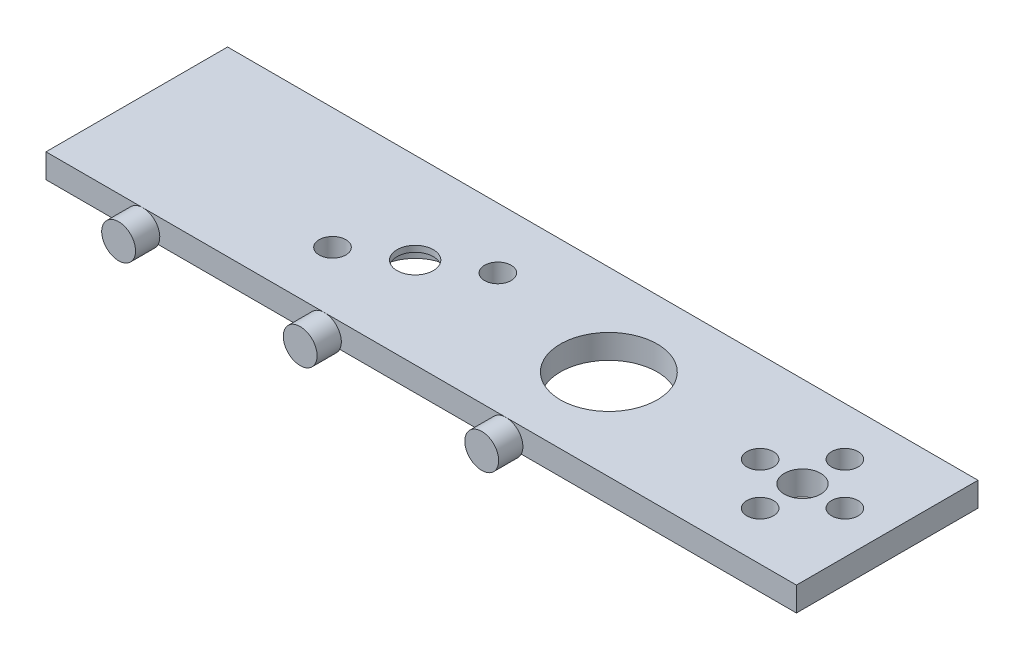
ISO-10303-21;
HEADER;
FILE_DESCRIPTION(('STEP AP214'),'2;1');
FILE_NAME('part.step','',(''),(''),'','','');
FILE_SCHEMA(('AUTOMOTIVE_DESIGN { 1 0 10303 214 1 1 1 1 }'));
ENDSEC;
DATA;
#1=APPLICATION_CONTEXT('core data for automotive mechanical design processes');
#2=APPLICATION_PROTOCOL_DEFINITION('international standard','automotive_design',2000,#1);
#3=PRODUCT_CONTEXT('',#1,'mechanical');
#4=PRODUCT('Part','Part','',(#3));
#5=PRODUCT_RELATED_PRODUCT_CATEGORY('part','',(#4));
#6=PRODUCT_DEFINITION_FORMATION('','',#4);
#7=PRODUCT_DEFINITION_CONTEXT('part definition',#1,'design');
#8=PRODUCT_DEFINITION('design','',#6,#7);
#9=PRODUCT_DEFINITION_SHAPE('','',#8);
#10=(LENGTH_UNIT() NAMED_UNIT(*) SI_UNIT(.MILLI.,.METRE.));
#11=(NAMED_UNIT(*) PLANE_ANGLE_UNIT() SI_UNIT($,.RADIAN.));
#12=(NAMED_UNIT(*) SI_UNIT($,.STERADIAN.) SOLID_ANGLE_UNIT());
#13=UNCERTAINTY_MEASURE_WITH_UNIT(LENGTH_MEASURE(1.E-05),#10,'distance_accuracy_value','');
#14=(GEOMETRIC_REPRESENTATION_CONTEXT(3) GLOBAL_UNCERTAINTY_ASSIGNED_CONTEXT((#13)) GLOBAL_UNIT_ASSIGNED_CONTEXT((#10,
#11,#12)) REPRESENTATION_CONTEXT('',''));
#15=CARTESIAN_POINT('',(0.,0.,0.));
#16=DIRECTION('',(0.,0.,1.));
#17=DIRECTION('',(1.,0.,0.));
#18=AXIS2_PLACEMENT_3D('',#15,#16,#17);
#19=CARTESIAN_POINT('',(-8.,2.,0.));
#20=DIRECTION('',(0.,-1.,0.));
#21=DIRECTION('',(0.,0.,-1.));
#22=AXIS2_PLACEMENT_3D('',#19,#20,#21);
#23=CYLINDRICAL_SURFACE('',#22,1.5);
#24=CARTESIAN_POINT('',(-8.,2.,0.));
#25=DIRECTION('',(0.,1.,0.));
#26=DIRECTION('',(0.,0.,1.));
#27=AXIS2_PLACEMENT_3D('',#24,#25,#26);
#28=CIRCLE('',#27,1.5);
#29=CARTESIAN_POINT('',(-8.,2.,1.5));
#30=VERTEX_POINT('',#29);
#31=EDGE_CURVE('E281',#30,#30,#28,.T.);
#32=ORIENTED_EDGE('',*,*,#31,.T.);
#33=EDGE_LOOP('',(#32));
#34=FACE_BOUND('',#33,.T.);
#35=CARTESIAN_POINT('',(-8.,1.5,0.));
#36=DIRECTION('',(0.,-1.,0.));
#37=DIRECTION('',(0.,0.,-1.));
#38=AXIS2_PLACEMENT_3D('',#35,#36,#37);
#39=CIRCLE('',#38,1.5);
#40=CARTESIAN_POINT('',(-8.,1.5,-1.5));
#41=VERTEX_POINT('',#40);
#42=EDGE_CURVE('E111',#41,#41,#39,.T.);
#43=ORIENTED_EDGE('',*,*,#42,.T.);
#44=EDGE_LOOP('',(#43));
#45=FACE_BOUND('',#44,.T.);
#46=ADVANCED_FACE('F107',(#34,#45),#23,.F.);
#47=CARTESIAN_POINT('',(0.,2.,7.5));
#48=DIRECTION('',(0.,0.,1.));
#49=DIRECTION('',(1.,0.,0.));
#50=AXIS2_PLACEMENT_3D('',#47,#48,#49);
#51=PLANE('',#50);
#52=CARTESIAN_POINT('',(-23.,0.6,7.5));
#53=DIRECTION('',(0.,0.,1.));
#54=DIRECTION('',(1.,0.,0.));
#55=AXIS2_PLACEMENT_3D('',#52,#53,#54);
#56=CIRCLE('',#55,1.4);
#57=CARTESIAN_POINT('',(-23.,2.,7.5));
#58=VERTEX_POINT('',#57);
#59=CARTESIAN_POINT('',(-24.2649110640673,0.,7.5));
#60=VERTEX_POINT('',#59);
#61=EDGE_CURVE('E119',#58,#60,#56,.T.);
#62=ORIENTED_EDGE('',*,*,#61,.F.);
#63=DIRECTION('',(-1.,0.,0.));
#64=VECTOR('',#63,1.);
#65=CARTESIAN_POINT('',(0.,2.,7.5));
#66=LINE('',#65,#64);
#67=CARTESIAN_POINT('',(-31.,2.,7.5));
#68=VERTEX_POINT('',#67);
#69=EDGE_CURVE('E193',#58,#68,#66,.T.);
#70=ORIENTED_EDGE('',*,*,#69,.T.);
#71=DIRECTION('',(0.,-1.,0.));
#72=VECTOR('',#71,1.);
#73=CARTESIAN_POINT('',(-31.,2.,7.5));
#74=LINE('',#73,#72);
#75=CARTESIAN_POINT('',(-31.,0.,7.5));
#76=VERTEX_POINT('',#75);
#77=EDGE_CURVE('E219',#68,#76,#74,.T.);
#78=ORIENTED_EDGE('',*,*,#77,.T.);
#79=DIRECTION('',(-1.,0.,0.));
#80=VECTOR('',#79,1.);
#81=CARTESIAN_POINT('',(0.,0.,7.5));
#82=LINE('',#81,#80);
#83=EDGE_CURVE('E127',#60,#76,#82,.T.);
#84=ORIENTED_EDGE('',*,*,#83,.F.);
#85=EDGE_LOOP('',(#62,#70,#78,#84));
#86=FACE_BOUND('',#85,.T.);
#87=ADVANCED_FACE('F355',(#86),#51,.T.);
#88=CARTESIAN_POINT('',(-21.7350889359327,0.,7.5));
#89=VERTEX_POINT('',#88);
#90=EDGE_CURVE('E12',#89,#58,#56,.T.);
#91=ORIENTED_EDGE('',*,*,#90,.F.);
#92=CARTESIAN_POINT('',(-9.26491106406735,0.,7.5));
#93=VERTEX_POINT('',#92);
#94=EDGE_CURVE('E361',#93,#89,#82,.T.);
#95=ORIENTED_EDGE('',*,*,#94,.F.);
#96=CARTESIAN_POINT('',(-8.,0.6,7.5));
#97=DIRECTION('',(0.,0.,1.));
#98=DIRECTION('',(1.,0.,0.));
#99=AXIS2_PLACEMENT_3D('',#96,#97,#98);
#100=CIRCLE('',#99,1.4);
#101=CARTESIAN_POINT('',(-8.,2.,7.5));
#102=VERTEX_POINT('',#101);
#103=EDGE_CURVE('E224',#102,#93,#100,.T.);
#104=ORIENTED_EDGE('',*,*,#103,.F.);
#105=EDGE_CURVE('E200',#102,#58,#66,.T.);
#106=ORIENTED_EDGE('',*,*,#105,.T.);
#107=EDGE_LOOP('',(#91,#95,#104,#106));
#108=FACE_BOUND('',#107,.T.);
#109=ADVANCED_FACE('F359',(#108),#51,.T.);
#110=CARTESIAN_POINT('',(-6.73508893593265,0.,7.5));
#111=VERTEX_POINT('',#110);
#112=EDGE_CURVE('E117',#111,#102,#100,.T.);
#113=ORIENTED_EDGE('',*,*,#112,.F.);
#114=CARTESIAN_POINT('',(5.73508893593265,0.,7.5));
#115=VERTEX_POINT('',#114);
#116=EDGE_CURVE('E208',#115,#111,#82,.T.);
#117=ORIENTED_EDGE('',*,*,#116,.F.);
#118=CARTESIAN_POINT('',(7.,0.6,7.5));
#119=DIRECTION('',(0.,0.,1.));
#120=DIRECTION('',(1.,0.,0.));
#121=AXIS2_PLACEMENT_3D('',#118,#119,#120);
#122=CIRCLE('',#121,1.4);
#123=CARTESIAN_POINT('',(7.,2.,7.5));
#124=VERTEX_POINT('',#123);
#125=EDGE_CURVE('E205',#124,#115,#122,.T.);
#126=ORIENTED_EDGE('',*,*,#125,.F.);
#127=EDGE_CURVE('E191',#124,#102,#66,.T.);
#128=ORIENTED_EDGE('',*,*,#127,.T.);
#129=EDGE_LOOP('',(#113,#117,#126,#128));
#130=FACE_BOUND('',#129,.T.);
#131=ADVANCED_FACE('F206',(#130),#51,.T.);
#132=CARTESIAN_POINT('',(-12.3301270189222,2.,2.50000000000001));
#133=DIRECTION('',(0.,-1.,0.));
#134=DIRECTION('',(0.,0.,-1.));
#135=AXIS2_PLACEMENT_3D('',#132,#133,#134);
#136=CYLINDRICAL_SURFACE('',#135,1.1);
#137=CARTESIAN_POINT('',(-12.3301270189222,2.,2.50000000000001));
#138=DIRECTION('',(0.,1.,0.));
#139=DIRECTION('',(0.,0.,1.));
#140=AXIS2_PLACEMENT_3D('',#137,#138,#139);
#141=CIRCLE('',#140,1.1);
#142=CARTESIAN_POINT('',(-12.3301270189222,2.,3.60000000000001));
#143=VERTEX_POINT('',#142);
#144=EDGE_CURVE('E238',#143,#143,#141,.T.);
#145=ORIENTED_EDGE('',*,*,#144,.T.);
#146=EDGE_LOOP('',(#145));
#147=FACE_BOUND('',#146,.T.);
#148=CARTESIAN_POINT('',(-12.3301270189222,0.,2.50000000000001));
#149=DIRECTION('',(0.,1.,0.));
#150=DIRECTION('',(0.,0.,1.));
#151=AXIS2_PLACEMENT_3D('',#148,#149,#150);
#152=CIRCLE('',#151,1.1);
#153=CARTESIAN_POINT('',(-12.3301270189222,0.,3.60000000000001));
#154=VERTEX_POINT('',#153);
#155=EDGE_CURVE('E243',#154,#154,#152,.T.);
#156=ORIENTED_EDGE('',*,*,#155,.F.);
#157=EDGE_LOOP('',(#156));
#158=FACE_BOUND('',#157,.T.);
#159=ADVANCED_FACE('F458',(#147,#158),#136,.F.);
#160=CARTESIAN_POINT('',(-3.66987298107781,2.,-2.50000000000001));
#161=DIRECTION('',(0.,-1.,0.));
#162=DIRECTION('',(0.,0.,-1.));
#163=AXIS2_PLACEMENT_3D('',#160,#161,#162);
#164=CYLINDRICAL_SURFACE('',#163,1.1);
#165=CARTESIAN_POINT('',(-3.66987298107781,2.,-2.50000000000001));
#166=DIRECTION('',(0.,1.,0.));
#167=DIRECTION('',(0.,0.,1.));
#168=AXIS2_PLACEMENT_3D('',#165,#166,#167);
#169=CIRCLE('',#168,1.1);
#170=CARTESIAN_POINT('',(-3.66987298107781,2.,-1.40000000000001));
#171=VERTEX_POINT('',#170);
#172=EDGE_CURVE('E248',#171,#171,#169,.T.);
#173=ORIENTED_EDGE('',*,*,#172,.T.);
#174=EDGE_LOOP('',(#173));
#175=FACE_BOUND('',#174,.T.);
#176=CARTESIAN_POINT('',(-3.66987298107781,0.,-2.50000000000001));
#177=DIRECTION('',(0.,1.,0.));
#178=DIRECTION('',(0.,0.,1.));
#179=AXIS2_PLACEMENT_3D('',#176,#177,#178);
#180=CIRCLE('',#179,1.1);
#181=CARTESIAN_POINT('',(-3.66987298107781,0.,-1.40000000000001));
#182=VERTEX_POINT('',#181);
#183=EDGE_CURVE('E242',#182,#182,#180,.T.);
#184=ORIENTED_EDGE('',*,*,#183,.F.);
#185=EDGE_LOOP('',(#184));
#186=FACE_BOUND('',#185,.T.);
#187=ADVANCED_FACE('F448',(#175,#186),#164,.F.);
#188=CARTESIAN_POINT('',(8.26491106406735,0.,7.5));
#189=VERTEX_POINT('',#188);
#190=EDGE_CURVE('E183',#189,#124,#122,.T.);
#191=ORIENTED_EDGE('',*,*,#190,.F.);
#192=CARTESIAN_POINT('',(31.,0.,7.5));
#193=VERTEX_POINT('',#192);
#194=EDGE_CURVE('E323',#193,#189,#82,.T.);
#195=ORIENTED_EDGE('',*,*,#194,.F.);
#196=DIRECTION('',(0.,-1.,0.));
#197=VECTOR('',#196,1.);
#198=CARTESIAN_POINT('',(31.,2.,7.5));
#199=LINE('',#198,#197);
#200=CARTESIAN_POINT('',(31.,2.,7.5));
#201=VERTEX_POINT('',#200);
#202=EDGE_CURVE('E185',#201,#193,#199,.T.);
#203=ORIENTED_EDGE('',*,*,#202,.F.);
#204=EDGE_CURVE('E178',#201,#124,#66,.T.);
#205=ORIENTED_EDGE('',*,*,#204,.T.);
#206=EDGE_LOOP('',(#191,#195,#203,#205));
#207=FACE_BOUND('',#206,.T.);
#208=ADVANCED_FACE('F180',(#207),#51,.T.);
#209=CARTESIAN_POINT('',(31.,2.,0.));
#210=DIRECTION('',(1.,0.,0.));
#211=DIRECTION('',(0.,0.,-1.));
#212=AXIS2_PLACEMENT_3D('',#209,#210,#211);
#213=PLANE('',#212);
#214=DIRECTION('',(0.,0.,1.));
#215=VECTOR('',#214,1.);
#216=CARTESIAN_POINT('',(31.,0.,0.));
#217=LINE('',#216,#215);
#218=CARTESIAN_POINT('',(31.,0.,-7.5));
#219=VERTEX_POINT('',#218);
#220=EDGE_CURVE('E326',#219,#193,#217,.T.);
#221=ORIENTED_EDGE('',*,*,#220,.F.);
#222=DIRECTION('',(0.,-1.,0.));
#223=VECTOR('',#222,1.);
#224=CARTESIAN_POINT('',(31.,2.,-7.5));
#225=LINE('',#224,#223);
#226=CARTESIAN_POINT('',(31.,2.,-7.5));
#227=VERTEX_POINT('',#226);
#228=EDGE_CURVE('E336',#227,#219,#225,.T.);
#229=ORIENTED_EDGE('',*,*,#228,.F.);
#230=DIRECTION('',(0.,0.,1.));
#231=VECTOR('',#230,1.);
#232=CARTESIAN_POINT('',(31.,2.,0.));
#233=LINE('',#232,#231);
#234=EDGE_CURVE('E190',#227,#201,#233,.T.);
#235=ORIENTED_EDGE('',*,*,#234,.T.);
#236=ORIENTED_EDGE('',*,*,#202,.T.);
#237=EDGE_LOOP('',(#221,#229,#235,#236));
#238=FACE_BOUND('',#237,.T.);
#239=ADVANCED_FACE('F342',(#238),#213,.T.);
#240=CARTESIAN_POINT('',(0.,2.,-7.5));
#241=DIRECTION('',(0.,0.,-1.));
#242=DIRECTION('',(-1.,0.,0.));
#243=AXIS2_PLACEMENT_3D('',#240,#241,#242);
#244=PLANE('',#243);
#245=DIRECTION('',(1.,0.,0.));
#246=VECTOR('',#245,1.);
#247=CARTESIAN_POINT('',(0.,0.,-7.5));
#248=LINE('',#247,#246);
#249=CARTESIAN_POINT('',(-31.,0.,-7.5));
#250=VERTEX_POINT('',#249);
#251=EDGE_CURVE('E261',#250,#219,#248,.T.);
#252=ORIENTED_EDGE('',*,*,#251,.F.);
#253=DIRECTION('',(0.,-1.,0.));
#254=VECTOR('',#253,1.);
#255=CARTESIAN_POINT('',(-31.,2.,-7.5));
#256=LINE('',#255,#254);
#257=CARTESIAN_POINT('',(-31.,2.,-7.5));
#258=VERTEX_POINT('',#257);
#259=EDGE_CURVE('E295',#258,#250,#256,.T.);
#260=ORIENTED_EDGE('',*,*,#259,.F.);
#261=DIRECTION('',(1.,0.,0.));
#262=VECTOR('',#261,1.);
#263=CARTESIAN_POINT('',(0.,2.,-7.5));
#264=LINE('',#263,#262);
#265=EDGE_CURVE('E291',#258,#227,#264,.T.);
#266=ORIENTED_EDGE('',*,*,#265,.T.);
#267=ORIENTED_EDGE('',*,*,#228,.T.);
#268=EDGE_LOOP('',(#252,#260,#266,#267));
#269=FACE_BOUND('',#268,.T.);
#270=ADVANCED_FACE('F350',(#269),#244,.T.);
#271=CARTESIAN_POINT('',(-31.,2.,0.));
#272=DIRECTION('',(-1.,0.,0.));
#273=DIRECTION('',(0.,0.,1.));
#274=AXIS2_PLACEMENT_3D('',#271,#272,#273);
#275=PLANE('',#274);
#276=DIRECTION('',(0.,0.,-1.));
#277=VECTOR('',#276,1.);
#278=CARTESIAN_POINT('',(-31.,0.,0.));
#279=LINE('',#278,#277);
#280=EDGE_CURVE('E319',#76,#250,#279,.T.);
#281=ORIENTED_EDGE('',*,*,#280,.F.);
#282=ORIENTED_EDGE('',*,*,#77,.F.);
#283=DIRECTION('',(0.,0.,-1.));
#284=VECTOR('',#283,1.);
#285=CARTESIAN_POINT('',(-31.,2.,0.));
#286=LINE('',#285,#284);
#287=EDGE_CURVE('E285',#68,#258,#286,.T.);
#288=ORIENTED_EDGE('',*,*,#287,.T.);
#289=ORIENTED_EDGE('',*,*,#259,.T.);
#290=EDGE_LOOP('',(#281,#282,#288,#289));
#291=FACE_BOUND('',#290,.T.);
#292=ADVANCED_FACE('F354',(#291),#275,.T.);
#293=CARTESIAN_POINT('',(8.,2.,0.));
#294=DIRECTION('',(0.,-1.,0.));
#295=DIRECTION('',(0.,0.,-1.));
#296=AXIS2_PLACEMENT_3D('',#293,#294,#295);
#297=CYLINDRICAL_SURFACE('',#296,4.);
#298=CARTESIAN_POINT('',(8.,2.,0.));
#299=DIRECTION('',(0.,1.,0.));
#300=DIRECTION('',(0.,0.,1.));
#301=AXIS2_PLACEMENT_3D('',#298,#299,#300);
#302=CIRCLE('',#301,4.);
#303=CARTESIAN_POINT('',(8.,2.,4.));
#304=VERTEX_POINT('',#303);
#305=EDGE_CURVE('E277',#304,#304,#302,.T.);
#306=ORIENTED_EDGE('',*,*,#305,.T.);
#307=EDGE_LOOP('',(#306));
#308=FACE_BOUND('',#307,.T.);
#309=CARTESIAN_POINT('',(8.,0.,0.));
#310=DIRECTION('',(0.,1.,0.));
#311=DIRECTION('',(0.,0.,1.));
#312=AXIS2_PLACEMENT_3D('',#309,#310,#311);
#313=CIRCLE('',#312,4.);
#314=CARTESIAN_POINT('',(8.,0.,4.));
#315=VERTEX_POINT('',#314);
#316=EDGE_CURVE('E315',#315,#315,#313,.T.);
#317=ORIENTED_EDGE('',*,*,#316,.F.);
#318=EDGE_LOOP('',(#317));
#319=FACE_BOUND('',#318,.T.);
#320=ADVANCED_FACE('F424',(#308,#319),#297,.F.);
#321=CARTESIAN_POINT('',(24.,2.,0.));
#322=DIRECTION('',(0.,-1.,0.));
#323=DIRECTION('',(0.,0.,-1.));
#324=AXIS2_PLACEMENT_3D('',#321,#322,#323);
#325=CYLINDRICAL_SURFACE('',#324,1.5);
#326=CARTESIAN_POINT('',(24.,2.,0.));
#327=DIRECTION('',(0.,1.,0.));
#328=DIRECTION('',(0.,0.,1.));
#329=AXIS2_PLACEMENT_3D('',#326,#327,#328);
#330=CIRCLE('',#329,1.5);
#331=CARTESIAN_POINT('',(24.,2.,1.5));
#332=VERTEX_POINT('',#331);
#333=EDGE_CURVE('E273',#332,#332,#330,.T.);
#334=ORIENTED_EDGE('',*,*,#333,.T.);
#335=EDGE_LOOP('',(#334));
#336=FACE_BOUND('',#335,.T.);
#337=CARTESIAN_POINT('',(24.,0.,0.));
#338=DIRECTION('',(0.,1.,0.));
#339=DIRECTION('',(0.,0.,1.));
#340=AXIS2_PLACEMENT_3D('',#337,#338,#339);
#341=CIRCLE('',#340,1.5);
#342=CARTESIAN_POINT('',(24.,0.,1.5));
#343=VERTEX_POINT('',#342);
#344=EDGE_CURVE('E311',#343,#343,#341,.T.);
#345=ORIENTED_EDGE('',*,*,#344,.F.);
#346=EDGE_LOOP('',(#345));
#347=FACE_BOUND('',#346,.T.);
#348=ADVANCED_FACE('F426',(#336,#347),#325,.F.);
#349=CARTESIAN_POINT('',(27.5,2.,0.));
#350=DIRECTION('',(0.,-1.,0.));
#351=DIRECTION('',(0.,0.,-1.));
#352=AXIS2_PLACEMENT_3D('',#349,#350,#351);
#353=CYLINDRICAL_SURFACE('',#352,1.1);
#354=CARTESIAN_POINT('',(27.5,2.,0.));
#355=DIRECTION('',(0.,1.,0.));
#356=DIRECTION('',(0.,0.,1.));
#357=AXIS2_PLACEMENT_3D('',#354,#355,#356);
#358=CIRCLE('',#357,1.1);
#359=CARTESIAN_POINT('',(27.5,2.,1.1));
#360=VERTEX_POINT('',#359);
#361=EDGE_CURVE('E269',#360,#360,#358,.T.);
#362=ORIENTED_EDGE('',*,*,#361,.T.);
#363=EDGE_LOOP('',(#362));
#364=FACE_BOUND('',#363,.T.);
#365=CARTESIAN_POINT('',(27.5,0.,0.));
#366=DIRECTION('',(0.,1.,0.));
#367=DIRECTION('',(0.,0.,1.));
#368=AXIS2_PLACEMENT_3D('',#365,#366,#367);
#369=CIRCLE('',#368,1.1);
#370=CARTESIAN_POINT('',(27.5,0.,1.1));
#371=VERTEX_POINT('',#370);
#372=EDGE_CURVE('E307',#371,#371,#369,.T.);
#373=ORIENTED_EDGE('',*,*,#372,.F.);
#374=EDGE_LOOP('',(#373));
#375=FACE_BOUND('',#374,.T.);
#376=ADVANCED_FACE('F433',(#364,#375),#353,.F.);
#377=CARTESIAN_POINT('',(24.,2.,3.5));
#378=DIRECTION('',(0.,-1.,0.));
#379=DIRECTION('',(0.,0.,-1.));
#380=AXIS2_PLACEMENT_3D('',#377,#378,#379);
#381=CYLINDRICAL_SURFACE('',#380,1.1);
#382=CARTESIAN_POINT('',(24.,2.,3.5));
#383=DIRECTION('',(0.,1.,0.));
#384=DIRECTION('',(0.,0.,1.));
#385=AXIS2_PLACEMENT_3D('',#382,#383,#384);
#386=CIRCLE('',#385,1.1);
#387=CARTESIAN_POINT('',(24.,2.,4.6));
#388=VERTEX_POINT('',#387);
#389=EDGE_CURVE('E265',#388,#388,#386,.T.);
#390=ORIENTED_EDGE('',*,*,#389,.T.);
#391=EDGE_LOOP('',(#390));
#392=FACE_BOUND('',#391,.T.);
#393=CARTESIAN_POINT('',(24.,0.,3.5));
#394=DIRECTION('',(0.,1.,0.));
#395=DIRECTION('',(0.,0.,1.));
#396=AXIS2_PLACEMENT_3D('',#393,#394,#395);
#397=CIRCLE('',#396,1.1);
#398=CARTESIAN_POINT('',(24.,0.,4.6));
#399=VERTEX_POINT('',#398);
#400=EDGE_CURVE('E303',#399,#399,#397,.T.);
#401=ORIENTED_EDGE('',*,*,#400,.F.);
#402=EDGE_LOOP('',(#401));
#403=FACE_BOUND('',#402,.T.);
#404=ADVANCED_FACE('F607',(#392,#403),#381,.F.);
#405=CARTESIAN_POINT('',(20.5,2.,0.));
#406=DIRECTION('',(0.,-1.,0.));
#407=DIRECTION('',(0.,0.,-1.));
#408=AXIS2_PLACEMENT_3D('',#405,#406,#407);
#409=CYLINDRICAL_SURFACE('',#408,1.1);
#410=CARTESIAN_POINT('',(20.5,2.,0.));
#411=DIRECTION('',(0.,1.,0.));
#412=DIRECTION('',(0.,0.,1.));
#413=AXIS2_PLACEMENT_3D('',#410,#411,#412);
#414=CIRCLE('',#413,1.1);
#415=CARTESIAN_POINT('',(20.5,2.,1.1));
#416=VERTEX_POINT('',#415);
#417=EDGE_CURVE('E260',#416,#416,#414,.T.);
#418=ORIENTED_EDGE('',*,*,#417,.T.);
#419=EDGE_LOOP('',(#418));
#420=FACE_BOUND('',#419,.T.);
#421=CARTESIAN_POINT('',(20.5,0.,0.));
#422=DIRECTION('',(0.,1.,0.));
#423=DIRECTION('',(0.,0.,1.));
#424=AXIS2_PLACEMENT_3D('',#421,#422,#423);
#425=CIRCLE('',#424,1.1);
#426=CARTESIAN_POINT('',(20.5,0.,1.1));
#427=VERTEX_POINT('',#426);
#428=EDGE_CURVE('E299',#427,#427,#425,.T.);
#429=ORIENTED_EDGE('',*,*,#428,.F.);
#430=EDGE_LOOP('',(#429));
#431=FACE_BOUND('',#430,.T.);
#432=ADVANCED_FACE('F603',(#420,#431),#409,.F.);
#433=CARTESIAN_POINT('',(24.,2.,-3.5));
#434=DIRECTION('',(0.,-1.,0.));
#435=DIRECTION('',(0.,0.,-1.));
#436=AXIS2_PLACEMENT_3D('',#433,#434,#435);
#437=CYLINDRICAL_SURFACE('',#436,1.1);
#438=CARTESIAN_POINT('',(24.,2.,-3.5));
#439=DIRECTION('',(0.,1.,0.));
#440=DIRECTION('',(0.,0.,1.));
#441=AXIS2_PLACEMENT_3D('',#438,#439,#440);
#442=CIRCLE('',#441,1.1);
#443=CARTESIAN_POINT('',(24.,2.,-2.4));
#444=VERTEX_POINT('',#443);
#445=EDGE_CURVE('E256',#444,#444,#442,.T.);
#446=ORIENTED_EDGE('',*,*,#445,.T.);
#447=EDGE_LOOP('',(#446));
#448=FACE_BOUND('',#447,.T.);
#449=CARTESIAN_POINT('',(24.,0.,-3.5));
#450=DIRECTION('',(0.,1.,0.));
#451=DIRECTION('',(0.,0.,1.));
#452=AXIS2_PLACEMENT_3D('',#449,#450,#451);
#453=CIRCLE('',#452,1.1);
#454=CARTESIAN_POINT('',(24.,0.,-2.4));
#455=VERTEX_POINT('',#454);
#456=EDGE_CURVE('E252',#455,#455,#453,.T.);
#457=ORIENTED_EDGE('',*,*,#456,.F.);
#458=EDGE_LOOP('',(#457));
#459=FACE_BOUND('',#458,.T.);
#460=ADVANCED_FACE('F109',(#448,#459),#437,.F.);
#461=CARTESIAN_POINT('',(0.,0.,0.));
#462=DIRECTION('',(0.,1.,0.));
#463=DIRECTION('',(0.,0.,1.));
#464=AXIS2_PLACEMENT_3D('',#461,#462,#463);
#465=PLANE('',#464);
#466=CARTESIAN_POINT('',(-8.,0.,0.));
#467=DIRECTION('',(0.,-1.,0.));
#468=DIRECTION('',(0.,0.,-1.));
#469=AXIS2_PLACEMENT_3D('',#466,#467,#468);
#470=CIRCLE('',#469,3.);
#471=CARTESIAN_POINT('',(-8.,0.,-3.));
#472=VERTEX_POINT('',#471);
#473=EDGE_CURVE('E392',#472,#472,#470,.T.);
#474=ORIENTED_EDGE('',*,*,#473,.F.);
#475=EDGE_LOOP('',(#474));
#476=FACE_BOUND('',#475,.T.);
#477=ORIENTED_EDGE('',*,*,#456,.T.);
#478=EDGE_LOOP('',(#477));
#479=FACE_BOUND('',#478,.T.);
#480=ORIENTED_EDGE('',*,*,#428,.T.);
#481=EDGE_LOOP('',(#480));
#482=FACE_BOUND('',#481,.T.);
#483=ORIENTED_EDGE('',*,*,#400,.T.);
#484=EDGE_LOOP('',(#483));
#485=FACE_BOUND('',#484,.T.);
#486=ORIENTED_EDGE('',*,*,#372,.T.);
#487=EDGE_LOOP('',(#486));
#488=FACE_BOUND('',#487,.T.);
#489=ORIENTED_EDGE('',*,*,#344,.T.);
#490=EDGE_LOOP('',(#489));
#491=FACE_BOUND('',#490,.T.);
#492=ORIENTED_EDGE('',*,*,#316,.T.);
#493=EDGE_LOOP('',(#492));
#494=FACE_BOUND('',#493,.T.);
#495=ORIENTED_EDGE('',*,*,#280,.T.);
#496=ORIENTED_EDGE('',*,*,#251,.T.);
#497=ORIENTED_EDGE('',*,*,#220,.T.);
#498=ORIENTED_EDGE('',*,*,#194,.T.);
#499=EDGE_CURVE('E327',#189,#115,#82,.T.);
#500=ORIENTED_EDGE('',*,*,#499,.T.);
#501=ORIENTED_EDGE('',*,*,#116,.T.);
#502=EDGE_CURVE('E369',#111,#93,#82,.T.);
#503=ORIENTED_EDGE('',*,*,#502,.T.);
#504=ORIENTED_EDGE('',*,*,#94,.T.);
#505=EDGE_CURVE('E375',#89,#60,#82,.T.);
#506=ORIENTED_EDGE('',*,*,#505,.T.);
#507=ORIENTED_EDGE('',*,*,#83,.T.);
#508=EDGE_LOOP('',(#495,#496,#497,#498,#500,#501,#503,#504,#506,#507));
#509=FACE_BOUND('',#508,.T.);
#510=ORIENTED_EDGE('',*,*,#183,.T.);
#511=EDGE_LOOP('',(#510));
#512=FACE_BOUND('',#511,.T.);
#513=ORIENTED_EDGE('',*,*,#155,.T.);
#514=EDGE_LOOP('',(#513));
#515=FACE_BOUND('',#514,.T.);
#516=ADVANCED_FACE('F345',(#476,#479,#482,#485,#488,#491,#494,#509,#512,#515),#465,.F.);
#517=CARTESIAN_POINT('',(0.,2.,0.));
#518=DIRECTION('',(0.,1.,0.));
#519=DIRECTION('',(0.,0.,1.));
#520=AXIS2_PLACEMENT_3D('',#517,#518,#519);
#521=PLANE('',#520);
#522=ORIENTED_EDGE('',*,*,#172,.F.);
#523=EDGE_LOOP('',(#522));
#524=FACE_BOUND('',#523,.T.);
#525=ORIENTED_EDGE('',*,*,#445,.F.);
#526=EDGE_LOOP('',(#525));
#527=FACE_BOUND('',#526,.T.);
#528=ORIENTED_EDGE('',*,*,#417,.F.);
#529=EDGE_LOOP('',(#528));
#530=FACE_BOUND('',#529,.T.);
#531=ORIENTED_EDGE('',*,*,#389,.F.);
#532=EDGE_LOOP('',(#531));
#533=FACE_BOUND('',#532,.T.);
#534=ORIENTED_EDGE('',*,*,#361,.F.);
#535=EDGE_LOOP('',(#534));
#536=FACE_BOUND('',#535,.T.);
#537=ORIENTED_EDGE('',*,*,#333,.F.);
#538=EDGE_LOOP('',(#537));
#539=FACE_BOUND('',#538,.T.);
#540=ORIENTED_EDGE('',*,*,#305,.F.);
#541=EDGE_LOOP('',(#540));
#542=FACE_BOUND('',#541,.T.);
#543=ORIENTED_EDGE('',*,*,#31,.F.);
#544=EDGE_LOOP('',(#543));
#545=FACE_BOUND('',#544,.T.);
#546=ORIENTED_EDGE('',*,*,#287,.F.);
#547=ORIENTED_EDGE('',*,*,#69,.F.);
#548=ORIENTED_EDGE('',*,*,#105,.F.);
#549=ORIENTED_EDGE('',*,*,#127,.F.);
#550=ORIENTED_EDGE('',*,*,#204,.F.);
#551=ORIENTED_EDGE('',*,*,#234,.F.);
#552=ORIENTED_EDGE('',*,*,#265,.F.);
#553=EDGE_LOOP('',(#546,#547,#548,#549,#550,#551,#552));
#554=FACE_BOUND('',#553,.T.);
#555=ORIENTED_EDGE('',*,*,#144,.F.);
#556=EDGE_LOOP('',(#555));
#557=FACE_BOUND('',#556,.T.);
#558=ADVANCED_FACE('F197',(#524,#527,#530,#533,#536,#539,#542,#545,#554,#557),#521,.T.);
#559=CARTESIAN_POINT('',(7.,0.6,9.5));
#560=DIRECTION('',(0.,0.,-1.));
#561=DIRECTION('',(-1.,0.,0.));
#562=AXIS2_PLACEMENT_3D('',#559,#560,#561);
#563=CYLINDRICAL_SURFACE('',#562,1.4);
#564=CARTESIAN_POINT('',(7.,0.6,9.5));
#565=DIRECTION('',(0.,0.,1.));
#566=DIRECTION('',(1.,0.,0.));
#567=AXIS2_PLACEMENT_3D('',#564,#565,#566);
#568=CIRCLE('',#567,1.4);
#569=CARTESIAN_POINT('',(8.4,0.6,9.5));
#570=VERTEX_POINT('',#569);
#571=EDGE_CURVE('E229',#570,#570,#568,.T.);
#572=ORIENTED_EDGE('',*,*,#571,.F.);
#573=EDGE_LOOP('',(#572));
#574=FACE_BOUND('',#573,.T.);
#575=ORIENTED_EDGE('',*,*,#125,.T.);
#576=EDGE_CURVE('E214',#115,#189,#122,.T.);
#577=ORIENTED_EDGE('',*,*,#576,.T.);
#578=ORIENTED_EDGE('',*,*,#190,.T.);
#579=EDGE_LOOP('',(#575,#577,#578));
#580=FACE_BOUND('',#579,.T.);
#581=ADVANCED_FACE('F216',(#574,#580),#563,.T.);
#582=CARTESIAN_POINT('',(7.,0.6,9.5));
#583=DIRECTION('',(0.,0.,1.));
#584=DIRECTION('',(1.,0.,0.));
#585=AXIS2_PLACEMENT_3D('',#582,#583,#584);
#586=PLANE('',#585);
#587=ORIENTED_EDGE('',*,*,#571,.T.);
#588=EDGE_LOOP('',(#587));
#589=FACE_BOUND('',#588,.T.);
#590=ADVANCED_FACE('F463',(#589),#586,.T.);
#591=CARTESIAN_POINT('',(7.,0.6,7.5));
#592=DIRECTION('',(0.,0.,1.));
#593=DIRECTION('',(1.,0.,0.));
#594=AXIS2_PLACEMENT_3D('',#591,#592,#593);
#595=PLANE('',#594);
#596=ORIENTED_EDGE('',*,*,#499,.F.);
#597=ORIENTED_EDGE('',*,*,#576,.F.);
#598=EDGE_LOOP('',(#596,#597));
#599=FACE_BOUND('',#598,.T.);
#600=ADVANCED_FACE('F466',(#599),#595,.F.);
#601=CARTESIAN_POINT('',(-8.,0.6,9.5));
#602=DIRECTION('',(0.,0.,-1.));
#603=DIRECTION('',(-1.,0.,0.));
#604=AXIS2_PLACEMENT_3D('',#601,#602,#603);
#605=CYLINDRICAL_SURFACE('',#604,1.4);
#606=CARTESIAN_POINT('',(-8.,0.6,9.5));
#607=DIRECTION('',(0.,0.,1.));
#608=DIRECTION('',(1.,0.,0.));
#609=AXIS2_PLACEMENT_3D('',#606,#607,#608);
#610=CIRCLE('',#609,1.4);
#611=CARTESIAN_POINT('',(-6.6,0.6,9.5));
#612=VERTEX_POINT('',#611);
#613=EDGE_CURVE('E213',#612,#612,#610,.T.);
#614=ORIENTED_EDGE('',*,*,#613,.F.);
#615=EDGE_LOOP('',(#614));
#616=FACE_BOUND('',#615,.T.);
#617=ORIENTED_EDGE('',*,*,#103,.T.);
#618=EDGE_CURVE('E225',#93,#111,#100,.T.);
#619=ORIENTED_EDGE('',*,*,#618,.T.);
#620=ORIENTED_EDGE('',*,*,#112,.T.);
#621=EDGE_LOOP('',(#617,#619,#620));
#622=FACE_BOUND('',#621,.T.);
#623=ADVANCED_FACE('F366',(#616,#622),#605,.T.);
#624=CARTESIAN_POINT('',(-8.,0.6,9.5));
#625=DIRECTION('',(0.,0.,1.));
#626=DIRECTION('',(1.,0.,0.));
#627=AXIS2_PLACEMENT_3D('',#624,#625,#626);
#628=PLANE('',#627);
#629=ORIENTED_EDGE('',*,*,#613,.T.);
#630=EDGE_LOOP('',(#629));
#631=FACE_BOUND('',#630,.T.);
#632=ADVANCED_FACE('F473',(#631),#628,.T.);
#633=CARTESIAN_POINT('',(-8.,0.6,7.5));
#634=DIRECTION('',(0.,0.,1.));
#635=DIRECTION('',(1.,0.,0.));
#636=AXIS2_PLACEMENT_3D('',#633,#634,#635);
#637=PLANE('',#636);
#638=ORIENTED_EDGE('',*,*,#502,.F.);
#639=ORIENTED_EDGE('',*,*,#618,.F.);
#640=EDGE_LOOP('',(#638,#639));
#641=FACE_BOUND('',#640,.T.);
#642=ADVANCED_FACE('F372',(#641),#637,.F.);
#643=CARTESIAN_POINT('',(-23.,0.6,9.5));
#644=DIRECTION('',(0.,0.,-1.));
#645=DIRECTION('',(-1.,0.,0.));
#646=AXIS2_PLACEMENT_3D('',#643,#644,#645);
#647=CYLINDRICAL_SURFACE('',#646,1.4);
#648=CARTESIAN_POINT('',(-23.,0.6,9.5));
#649=DIRECTION('',(0.,0.,1.));
#650=DIRECTION('',(1.,0.,0.));
#651=AXIS2_PLACEMENT_3D('',#648,#649,#650);
#652=CIRCLE('',#651,1.4);
#653=CARTESIAN_POINT('',(-21.6,0.6,9.5));
#654=VERTEX_POINT('',#653);
#655=EDGE_CURVE('E247',#654,#654,#652,.T.);
#656=ORIENTED_EDGE('',*,*,#655,.F.);
#657=EDGE_LOOP('',(#656));
#658=FACE_BOUND('',#657,.T.);
#659=ORIENTED_EDGE('',*,*,#61,.T.);
#660=EDGE_CURVE('E120',#60,#89,#56,.T.);
#661=ORIENTED_EDGE('',*,*,#660,.T.);
#662=ORIENTED_EDGE('',*,*,#90,.T.);
#663=EDGE_LOOP('',(#659,#661,#662));
#664=FACE_BOUND('',#663,.T.);
#665=ADVANCED_FACE('F478',(#658,#664),#647,.T.);
#666=CARTESIAN_POINT('',(-23.,0.6,9.5));
#667=DIRECTION('',(0.,0.,1.));
#668=DIRECTION('',(1.,0.,0.));
#669=AXIS2_PLACEMENT_3D('',#666,#667,#668);
#670=PLANE('',#669);
#671=ORIENTED_EDGE('',*,*,#655,.T.);
#672=EDGE_LOOP('',(#671));
#673=FACE_BOUND('',#672,.T.);
#674=ADVANCED_FACE('F484',(#673),#670,.T.);
#675=CARTESIAN_POINT('',(-23.,0.6,7.5));
#676=DIRECTION('',(0.,0.,1.));
#677=DIRECTION('',(1.,0.,0.));
#678=AXIS2_PLACEMENT_3D('',#675,#676,#677);
#679=PLANE('',#678);
#680=ORIENTED_EDGE('',*,*,#505,.F.);
#681=ORIENTED_EDGE('',*,*,#660,.F.);
#682=EDGE_LOOP('',(#680,#681));
#683=FACE_BOUND('',#682,.T.);
#684=ADVANCED_FACE('F405',(#683),#679,.F.);
#685=CARTESIAN_POINT('',(-8.,1.5,0.));
#686=DIRECTION('',(0.,-1.,0.));
#687=DIRECTION('',(0.,0.,-1.));
#688=AXIS2_PLACEMENT_3D('',#685,#686,#687);
#689=CYLINDRICAL_SURFACE('',#688,3.);
#690=CARTESIAN_POINT('',(-8.,1.5,0.));
#691=DIRECTION('',(0.,-1.,0.));
#692=DIRECTION('',(0.,0.,-1.));
#693=AXIS2_PLACEMENT_3D('',#690,#691,#692);
#694=CIRCLE('',#693,3.);
#695=CARTESIAN_POINT('',(-8.,1.5,-3.));
#696=VERTEX_POINT('',#695);
#697=EDGE_CURVE('E236',#696,#696,#694,.T.);
#698=ORIENTED_EDGE('',*,*,#697,.F.);
#699=EDGE_LOOP('',(#698));
#700=FACE_BOUND('',#699,.T.);
#701=ORIENTED_EDGE('',*,*,#473,.T.);
#702=EDGE_LOOP('',(#701));
#703=FACE_BOUND('',#702,.T.);
#704=ADVANCED_FACE('F402',(#700,#703),#689,.F.);
#705=CARTESIAN_POINT('',(-8.,1.5,0.));
#706=DIRECTION('',(0.,-1.,0.));
#707=DIRECTION('',(0.,0.,-1.));
#708=AXIS2_PLACEMENT_3D('',#705,#706,#707);
#709=PLANE('',#708);
#710=ORIENTED_EDGE('',*,*,#42,.F.);
#711=EDGE_LOOP('',(#710));
#712=FACE_BOUND('',#711,.T.);
#713=ORIENTED_EDGE('',*,*,#697,.T.);
#714=EDGE_LOOP('',(#713));
#715=FACE_BOUND('',#714,.T.);
#716=ADVANCED_FACE('F400',(#712,#715),#709,.T.);
#717=CLOSED_SHELL('',(#46,#87,#109,#131,#159,#187,#208,#239,#270,#292,#320,#348,#376,#404,#432,
#460,#516,#558,#581,#590,#600,#623,#632,#642,#665,#674,#684,#704,#716));
#718=MANIFOLD_SOLID_BREP('B2',#717);
#719=ADVANCED_BREP_SHAPE_REPRESENTATION('',(#18,#718),#14);
#720=SHAPE_DEFINITION_REPRESENTATION(#9,#719);
ENDSEC;
END-ISO-10303-21;
